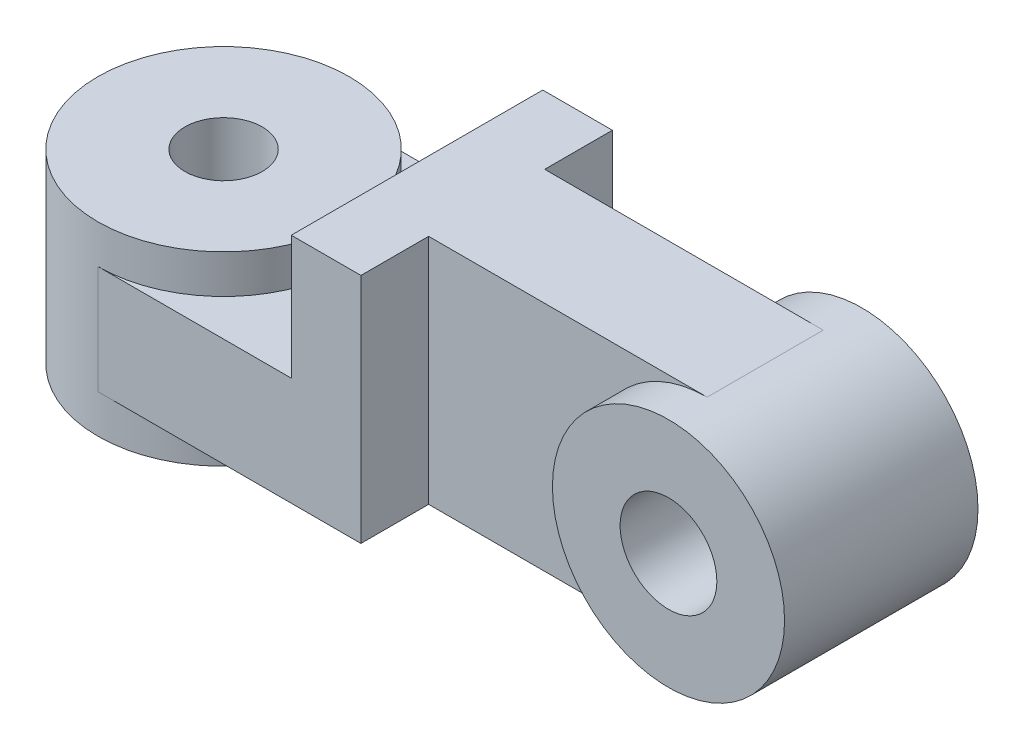
ISO-10303-21;
HEADER;
FILE_DESCRIPTION(('STEP AP214'),'2;1');
FILE_NAME('part.step','',(''),(''),'','','');
FILE_SCHEMA(('AUTOMOTIVE_DESIGN { 1 0 10303 214 1 1 1 1 }'));
ENDSEC;
DATA;
#1=APPLICATION_CONTEXT('core data for automotive mechanical design processes');
#2=APPLICATION_PROTOCOL_DEFINITION('international standard','automotive_design',2000,#1);
#3=PRODUCT_CONTEXT('',#1,'mechanical');
#4=PRODUCT('Part','Part','',(#3));
#5=PRODUCT_RELATED_PRODUCT_CATEGORY('part','',(#4));
#6=PRODUCT_DEFINITION_FORMATION('','',#4);
#7=PRODUCT_DEFINITION_CONTEXT('part definition',#1,'design');
#8=PRODUCT_DEFINITION('design','',#6,#7);
#9=PRODUCT_DEFINITION_SHAPE('','',#8);
#10=(LENGTH_UNIT() NAMED_UNIT(*) SI_UNIT(.MILLI.,.METRE.));
#11=(NAMED_UNIT(*) PLANE_ANGLE_UNIT() SI_UNIT($,.RADIAN.));
#12=(NAMED_UNIT(*) SI_UNIT($,.STERADIAN.) SOLID_ANGLE_UNIT());
#13=UNCERTAINTY_MEASURE_WITH_UNIT(LENGTH_MEASURE(1.E-05),#10,'distance_accuracy_value','');
#14=(GEOMETRIC_REPRESENTATION_CONTEXT(3) GLOBAL_UNCERTAINTY_ASSIGNED_CONTEXT((#13)) GLOBAL_UNIT_ASSIGNED_CONTEXT((#10,
#11,#12)) REPRESENTATION_CONTEXT('',''));
#15=CARTESIAN_POINT('',(0.,0.,0.));
#16=DIRECTION('',(0.,0.,1.));
#17=DIRECTION('',(1.,0.,0.));
#18=AXIS2_PLACEMENT_3D('',#15,#16,#17);
#19=CARTESIAN_POINT('',(68.,0.,0.));
#20=DIRECTION('',(-1.,0.,0.));
#21=DIRECTION('',(0.,0.,1.));
#22=AXIS2_PLACEMENT_3D('',#19,#20,#21);
#23=PLANE('',#22);
#24=DIRECTION('',(0.,-1.,0.));
#25=VECTOR('',#24,1.);
#26=CARTESIAN_POINT('',(68.,0.,15.));
#27=LINE('',#26,#25);
#28=CARTESIAN_POINT('',(68.,46.,15.));
#29=VERTEX_POINT('',#28);
#30=CARTESIAN_POINT('',(68.,-14.,15.));
#31=VERTEX_POINT('',#30);
#32=EDGE_CURVE('E56',#29,#31,#27,.T.);
#33=ORIENTED_EDGE('',*,*,#32,.F.);
#34=DIRECTION('',(0.,0.,1.));
#35=VECTOR('',#34,1.);
#36=CARTESIAN_POINT('',(68.,46.,32.5));
#37=LINE('',#36,#35);
#38=CARTESIAN_POINT('',(68.,46.,32.5));
#39=VERTEX_POINT('',#38);
#40=EDGE_CURVE('E160',#29,#39,#37,.T.);
#41=ORIENTED_EDGE('',*,*,#40,.T.);
#42=DIRECTION('',(0.,-1.,0.));
#43=VECTOR('',#42,1.);
#44=CARTESIAN_POINT('',(68.,-14.,32.5));
#45=LINE('',#44,#43);
#46=CARTESIAN_POINT('',(68.,-14.,32.5));
#47=VERTEX_POINT('',#46);
#48=EDGE_CURVE('E151',#39,#47,#45,.T.);
#49=ORIENTED_EDGE('',*,*,#48,.T.);
#50=DIRECTION('',(0.,0.,-1.));
#51=VECTOR('',#50,1.);
#52=CARTESIAN_POINT('',(68.,-14.,32.5));
#53=LINE('',#52,#51);
#54=EDGE_CURVE('E156',#47,#31,#53,.T.);
#55=ORIENTED_EDGE('',*,*,#54,.T.);
#56=EDGE_LOOP('',(#33,#41,#49,#55));
#57=FACE_BOUND('',#56,.T.);
#58=ADVANCED_FACE('F39',(#57),#23,.F.);
#59=CARTESIAN_POINT('',(0.,24.,0.));
#60=DIRECTION('',(0.,-1.,0.));
#61=DIRECTION('',(0.,0.,-1.));
#62=AXIS2_PLACEMENT_3D('',#59,#60,#61);
#63=CYLINDRICAL_SURFACE('',#62,10.);
#64=CARTESIAN_POINT('',(0.,24.,0.));
#65=DIRECTION('',(0.,1.,0.));
#66=DIRECTION('',(0.,0.,1.));
#67=AXIS2_PLACEMENT_3D('',#64,#65,#66);
#68=CIRCLE('',#67,10.);
#69=CARTESIAN_POINT('',(0.,24.,10.));
#70=VERTEX_POINT('',#69);
#71=EDGE_CURVE('E48',#70,#70,#68,.T.);
#72=ORIENTED_EDGE('',*,*,#71,.T.);
#73=EDGE_LOOP('',(#72));
#74=FACE_BOUND('',#73,.T.);
#75=CARTESIAN_POINT('',(0.,-24.,0.));
#76=DIRECTION('',(0.,1.,0.));
#77=DIRECTION('',(0.,0.,1.));
#78=AXIS2_PLACEMENT_3D('',#75,#76,#77);
#79=CIRCLE('',#78,10.);
#80=CARTESIAN_POINT('',(0.,-24.,10.));
#81=VERTEX_POINT('',#80);
#82=EDGE_CURVE('E196',#81,#81,#79,.T.);
#83=ORIENTED_EDGE('',*,*,#82,.F.);
#84=EDGE_LOOP('',(#83));
#85=FACE_BOUND('',#84,.T.);
#86=ADVANCED_FACE('F41',(#74,#85),#63,.F.);
#87=CARTESIAN_POINT('',(0.,24.,0.));
#88=DIRECTION('',(0.,-1.,0.));
#89=DIRECTION('',(0.,0.,-1.));
#90=AXIS2_PLACEMENT_3D('',#87,#88,#89);
#91=CYLINDRICAL_SURFACE('',#90,32.5);
#92=DIRECTION('',(0.,-1.,0.));
#93=VECTOR('',#92,1.);
#94=CARTESIAN_POINT('',(0.,14.,32.5));
#95=LINE('',#94,#93);
#96=CARTESIAN_POINT('',(0.,14.,32.5));
#97=VERTEX_POINT('',#96);
#98=CARTESIAN_POINT('',(0.,-14.,32.5));
#99=VERTEX_POINT('',#98);
#100=EDGE_CURVE('E193',#97,#99,#95,.T.);
#101=ORIENTED_EDGE('',*,*,#100,.F.);
#102=CARTESIAN_POINT('',(0.,14.,0.));
#103=DIRECTION('',(0.,1.,0.));
#104=DIRECTION('',(0.,0.,1.));
#105=AXIS2_PLACEMENT_3D('',#102,#103,#104);
#106=CIRCLE('',#105,32.5);
#107=CARTESIAN_POINT('',(0.,14.,-32.5));
#108=VERTEX_POINT('',#107);
#109=EDGE_CURVE('E174',#97,#108,#106,.T.);
#110=ORIENTED_EDGE('',*,*,#109,.T.);
#111=DIRECTION('',(0.,-1.,0.));
#112=VECTOR('',#111,1.);
#113=CARTESIAN_POINT('',(0.,14.,-32.5));
#114=LINE('',#113,#112);
#115=CARTESIAN_POINT('',(0.,-14.,-32.5));
#116=VERTEX_POINT('',#115);
#117=EDGE_CURVE('E185',#108,#116,#114,.T.);
#118=ORIENTED_EDGE('',*,*,#117,.T.);
#119=CARTESIAN_POINT('',(0.,-14.,0.));
#120=DIRECTION('',(0.,1.,0.));
#121=DIRECTION('',(0.,0.,1.));
#122=AXIS2_PLACEMENT_3D('',#119,#120,#121);
#123=CIRCLE('',#122,32.5);
#124=EDGE_CURVE('E173',#99,#116,#123,.T.);
#125=ORIENTED_EDGE('',*,*,#124,.F.);
#126=EDGE_LOOP('',(#101,#110,#118,#125));
#127=FACE_BOUND('',#126,.T.);
#128=CARTESIAN_POINT('',(0.,24.,0.));
#129=DIRECTION('',(0.,1.,0.));
#130=DIRECTION('',(0.,0.,1.));
#131=AXIS2_PLACEMENT_3D('',#128,#129,#130);
#132=CIRCLE('',#131,32.5);
#133=CARTESIAN_POINT('',(0.,24.,32.5));
#134=VERTEX_POINT('',#133);
#135=EDGE_CURVE('E11',#134,#134,#132,.T.);
#136=ORIENTED_EDGE('',*,*,#135,.F.);
#137=EDGE_LOOP('',(#136));
#138=FACE_BOUND('',#137,.T.);
#139=CARTESIAN_POINT('',(0.,-24.,0.));
#140=DIRECTION('',(0.,1.,0.));
#141=DIRECTION('',(0.,0.,1.));
#142=AXIS2_PLACEMENT_3D('',#139,#140,#141);
#143=CIRCLE('',#142,32.5);
#144=CARTESIAN_POINT('',(0.,-24.,32.5));
#145=VERTEX_POINT('',#144);
#146=EDGE_CURVE('E43',#145,#145,#143,.T.);
#147=ORIENTED_EDGE('',*,*,#146,.T.);
#148=EDGE_LOOP('',(#147));
#149=FACE_BOUND('',#148,.T.);
#150=ADVANCED_FACE('F204',(#127,#138,#149),#91,.T.);
#151=CARTESIAN_POINT('',(0.,24.,0.));
#152=DIRECTION('',(0.,1.,0.));
#153=DIRECTION('',(0.,0.,1.));
#154=AXIS2_PLACEMENT_3D('',#151,#152,#153);
#155=PLANE('',#154);
#156=ORIENTED_EDGE('',*,*,#71,.F.);
#157=EDGE_LOOP('',(#156));
#158=FACE_BOUND('',#157,.T.);
#159=ORIENTED_EDGE('',*,*,#135,.T.);
#160=EDGE_LOOP('',(#159));
#161=FACE_BOUND('',#160,.T.);
#162=ADVANCED_FACE('F209',(#158,#161),#155,.T.);
#163=CARTESIAN_POINT('',(0.,-24.,0.));
#164=DIRECTION('',(0.,1.,0.));
#165=DIRECTION('',(0.,0.,1.));
#166=AXIS2_PLACEMENT_3D('',#163,#164,#165);
#167=PLANE('',#166);
#168=ORIENTED_EDGE('',*,*,#82,.T.);
#169=EDGE_LOOP('',(#168));
#170=FACE_BOUND('',#169,.T.);
#171=ORIENTED_EDGE('',*,*,#146,.F.);
#172=EDGE_LOOP('',(#171));
#173=FACE_BOUND('',#172,.T.);
#174=ADVANCED_FACE('F206',(#170,#173),#167,.F.);
#175=CARTESIAN_POINT('',(0.,14.,32.5));
#176=DIRECTION('',(0.,0.,-1.));
#177=DIRECTION('',(-1.,0.,0.));
#178=AXIS2_PLACEMENT_3D('',#175,#176,#177);
#179=PLANE('',#178);
#180=DIRECTION('',(1.,0.,0.));
#181=VECTOR('',#180,1.);
#182=CARTESIAN_POINT('',(0.,-14.,32.5));
#183=LINE('',#182,#181);
#184=EDGE_CURVE('E188',#99,#47,#183,.T.);
#185=ORIENTED_EDGE('',*,*,#184,.T.);
#186=ORIENTED_EDGE('',*,*,#48,.F.);
#187=DIRECTION('',(-1.,0.,0.));
#188=VECTOR('',#187,1.);
#189=CARTESIAN_POINT('',(68.,46.,32.5));
#190=LINE('',#189,#188);
#191=CARTESIAN_POINT('',(50.,46.,32.5));
#192=VERTEX_POINT('',#191);
#193=EDGE_CURVE('E162',#39,#192,#190,.T.);
#194=ORIENTED_EDGE('',*,*,#193,.T.);
#195=DIRECTION('',(0.,-1.,0.));
#196=VECTOR('',#195,1.);
#197=CARTESIAN_POINT('',(50.,-14.,32.5));
#198=LINE('',#197,#196);
#199=CARTESIAN_POINT('',(50.,14.,32.5));
#200=VERTEX_POINT('',#199);
#201=EDGE_CURVE('E138',#192,#200,#198,.T.);
#202=ORIENTED_EDGE('',*,*,#201,.T.);
#203=DIRECTION('',(1.,0.,0.));
#204=VECTOR('',#203,1.);
#205=CARTESIAN_POINT('',(0.,14.,32.5));
#206=LINE('',#205,#204);
#207=EDGE_CURVE('E176',#97,#200,#206,.T.);
#208=ORIENTED_EDGE('',*,*,#207,.F.);
#209=ORIENTED_EDGE('',*,*,#100,.T.);
#210=EDGE_LOOP('',(#185,#186,#194,#202,#208,#209));
#211=FACE_BOUND('',#210,.T.);
#212=ADVANCED_FACE('F208',(#211),#179,.F.);
#213=CARTESIAN_POINT('',(0.,14.,-32.5));
#214=DIRECTION('',(0.,0.,1.));
#215=DIRECTION('',(1.,0.,0.));
#216=AXIS2_PLACEMENT_3D('',#213,#214,#215);
#217=PLANE('',#216);
#218=DIRECTION('',(-1.,0.,0.));
#219=VECTOR('',#218,1.);
#220=CARTESIAN_POINT('',(0.,-14.,-32.5));
#221=LINE('',#220,#219);
#222=CARTESIAN_POINT('',(68.,-14.,-32.5));
#223=VERTEX_POINT('',#222);
#224=EDGE_CURVE('E177',#223,#116,#221,.T.);
#225=ORIENTED_EDGE('',*,*,#224,.T.);
#226=ORIENTED_EDGE('',*,*,#117,.F.);
#227=DIRECTION('',(-1.,0.,0.));
#228=VECTOR('',#227,1.);
#229=CARTESIAN_POINT('',(0.,14.,-32.5));
#230=LINE('',#229,#228);
#231=CARTESIAN_POINT('',(50.,14.,-32.5));
#232=VERTEX_POINT('',#231);
#233=EDGE_CURVE('E182',#232,#108,#230,.T.);
#234=ORIENTED_EDGE('',*,*,#233,.F.);
#235=DIRECTION('',(0.,1.,0.));
#236=VECTOR('',#235,1.);
#237=CARTESIAN_POINT('',(50.,-14.,-32.5));
#238=LINE('',#237,#236);
#239=CARTESIAN_POINT('',(50.,46.,-32.5));
#240=VERTEX_POINT('',#239);
#241=EDGE_CURVE('E165',#232,#240,#238,.T.);
#242=ORIENTED_EDGE('',*,*,#241,.T.);
#243=DIRECTION('',(-1.,0.,0.));
#244=VECTOR('',#243,1.);
#245=CARTESIAN_POINT('',(68.,46.,-32.5));
#246=LINE('',#245,#244);
#247=CARTESIAN_POINT('',(68.,46.,-32.5));
#248=VERTEX_POINT('',#247);
#249=EDGE_CURVE('E170',#248,#240,#246,.T.);
#250=ORIENTED_EDGE('',*,*,#249,.F.);
#251=DIRECTION('',(0.,1.,0.));
#252=VECTOR('',#251,1.);
#253=CARTESIAN_POINT('',(68.,-14.,-32.5));
#254=LINE('',#253,#252);
#255=EDGE_CURVE('E158',#223,#248,#254,.T.);
#256=ORIENTED_EDGE('',*,*,#255,.F.);
#257=EDGE_LOOP('',(#225,#226,#234,#242,#250,#256));
#258=FACE_BOUND('',#257,.T.);
#259=ADVANCED_FACE('F215',(#258),#217,.F.);
#260=CARTESIAN_POINT('',(0.,14.,0.));
#261=DIRECTION('',(0.,1.,0.));
#262=DIRECTION('',(0.,0.,1.));
#263=AXIS2_PLACEMENT_3D('',#260,#261,#262);
#264=PLANE('',#263);
#265=ORIENTED_EDGE('',*,*,#109,.F.);
#266=ORIENTED_EDGE('',*,*,#207,.T.);
#267=DIRECTION('',(0.,0.,1.));
#268=VECTOR('',#267,1.);
#269=CARTESIAN_POINT('',(50.,14.,0.));
#270=LINE('',#269,#268);
#271=EDGE_CURVE('E179',#232,#200,#270,.T.);
#272=ORIENTED_EDGE('',*,*,#271,.F.);
#273=ORIENTED_EDGE('',*,*,#233,.T.);
#274=EDGE_LOOP('',(#265,#266,#272,#273));
#275=FACE_BOUND('',#274,.T.);
#276=ADVANCED_FACE('F242',(#275),#264,.T.);
#277=CARTESIAN_POINT('',(0.,-14.,0.));
#278=DIRECTION('',(0.,1.,0.));
#279=DIRECTION('',(0.,0.,1.));
#280=AXIS2_PLACEMENT_3D('',#277,#278,#279);
#281=PLANE('',#280);
#282=ORIENTED_EDGE('',*,*,#124,.T.);
#283=ORIENTED_EDGE('',*,*,#224,.F.);
#284=CARTESIAN_POINT('',(68.,-14.,-15.));
#285=VERTEX_POINT('',#284);
#286=EDGE_CURVE('E154',#285,#223,#53,.T.);
#287=ORIENTED_EDGE('',*,*,#286,.F.);
#288=DIRECTION('',(1.,0.,0.));
#289=VECTOR('',#288,1.);
#290=CARTESIAN_POINT('',(0.,-14.,-15.));
#291=LINE('',#290,#289);
#292=CARTESIAN_POINT('',(140.,-14.,-15.));
#293=VERTEX_POINT('',#292);
#294=EDGE_CURVE('E143',#285,#293,#291,.T.);
#295=ORIENTED_EDGE('',*,*,#294,.T.);
#296=DIRECTION('',(0.,0.,-1.));
#297=VECTOR('',#296,1.);
#298=CARTESIAN_POINT('',(140.,-14.,15.));
#299=LINE('',#298,#297);
#300=CARTESIAN_POINT('',(140.,-14.,15.));
#301=VERTEX_POINT('',#300);
#302=EDGE_CURVE('E124',#301,#293,#299,.T.);
#303=ORIENTED_EDGE('',*,*,#302,.F.);
#304=DIRECTION('',(1.,0.,0.));
#305=VECTOR('',#304,1.);
#306=CARTESIAN_POINT('',(0.,-14.,15.));
#307=LINE('',#306,#305);
#308=EDGE_CURVE('E149',#31,#301,#307,.T.);
#309=ORIENTED_EDGE('',*,*,#308,.F.);
#310=ORIENTED_EDGE('',*,*,#54,.F.);
#311=ORIENTED_EDGE('',*,*,#184,.F.);
#312=EDGE_LOOP('',(#282,#283,#287,#295,#303,#309,#310,#311));
#313=FACE_BOUND('',#312,.T.);
#314=ADVANCED_FACE('F237',(#313),#281,.F.);
#315=CARTESIAN_POINT('',(68.,46.,32.5));
#316=DIRECTION('',(0.,-1.,0.));
#317=DIRECTION('',(0.,0.,-1.));
#318=AXIS2_PLACEMENT_3D('',#315,#316,#317);
#319=PLANE('',#318);
#320=DIRECTION('',(0.,0.,1.));
#321=VECTOR('',#320,1.);
#322=CARTESIAN_POINT('',(50.,46.,32.5));
#323=LINE('',#322,#321);
#324=EDGE_CURVE('E155',#240,#192,#323,.T.);
#325=ORIENTED_EDGE('',*,*,#324,.T.);
#326=ORIENTED_EDGE('',*,*,#193,.F.);
#327=ORIENTED_EDGE('',*,*,#40,.F.);
#328=DIRECTION('',(1.,0.,0.));
#329=VECTOR('',#328,1.);
#330=CARTESIAN_POINT('',(0.,46.,15.));
#331=LINE('',#330,#329);
#332=CARTESIAN_POINT('',(140.,46.,15.));
#333=VERTEX_POINT('',#332);
#334=EDGE_CURVE('E137',#29,#333,#331,.T.);
#335=ORIENTED_EDGE('',*,*,#334,.T.);
#336=DIRECTION('',(0.,0.,-1.));
#337=VECTOR('',#336,1.);
#338=CARTESIAN_POINT('',(140.,46.,15.));
#339=LINE('',#338,#337);
#340=CARTESIAN_POINT('',(140.,46.,-15.));
#341=VERTEX_POINT('',#340);
#342=EDGE_CURVE('E121',#333,#341,#339,.T.);
#343=ORIENTED_EDGE('',*,*,#342,.T.);
#344=DIRECTION('',(1.,0.,0.));
#345=VECTOR('',#344,1.);
#346=CARTESIAN_POINT('',(0.,46.,-15.));
#347=LINE('',#346,#345);
#348=CARTESIAN_POINT('',(68.,46.,-15.));
#349=VERTEX_POINT('',#348);
#350=EDGE_CURVE('E129',#349,#341,#347,.T.);
#351=ORIENTED_EDGE('',*,*,#350,.F.);
#352=EDGE_CURVE('E64',#248,#349,#37,.T.);
#353=ORIENTED_EDGE('',*,*,#352,.F.);
#354=ORIENTED_EDGE('',*,*,#249,.T.);
#355=EDGE_LOOP('',(#325,#326,#327,#335,#343,#351,#353,#354));
#356=FACE_BOUND('',#355,.T.);
#357=ADVANCED_FACE('F135',(#356),#319,.F.);
#358=ORIENTED_EDGE('',*,*,#352,.T.);
#359=DIRECTION('',(0.,-1.,0.));
#360=VECTOR('',#359,1.);
#361=CARTESIAN_POINT('',(68.,0.,-15.));
#362=LINE('',#361,#360);
#363=EDGE_CURVE('E141',#349,#285,#362,.T.);
#364=ORIENTED_EDGE('',*,*,#363,.T.);
#365=ORIENTED_EDGE('',*,*,#286,.T.);
#366=ORIENTED_EDGE('',*,*,#255,.T.);
#367=EDGE_LOOP('',(#358,#364,#365,#366));
#368=FACE_BOUND('',#367,.T.);
#369=ADVANCED_FACE('F222',(#368),#23,.F.);
#370=CARTESIAN_POINT('',(50.,0.,0.));
#371=DIRECTION('',(-1.,0.,0.));
#372=DIRECTION('',(0.,0.,1.));
#373=AXIS2_PLACEMENT_3D('',#370,#371,#372);
#374=PLANE('',#373);
#375=ORIENTED_EDGE('',*,*,#241,.F.);
#376=ORIENTED_EDGE('',*,*,#271,.T.);
#377=ORIENTED_EDGE('',*,*,#201,.F.);
#378=ORIENTED_EDGE('',*,*,#324,.F.);
#379=EDGE_LOOP('',(#375,#376,#377,#378));
#380=FACE_BOUND('',#379,.T.);
#381=ADVANCED_FACE('F230',(#380),#374,.T.);
#382=CARTESIAN_POINT('',(0.,0.,15.));
#383=DIRECTION('',(0.,0.,1.));
#384=DIRECTION('',(1.,0.,0.));
#385=AXIS2_PLACEMENT_3D('',#382,#383,#384);
#386=PLANE('',#385);
#387=CARTESIAN_POINT('',(140.,16.,15.));
#388=DIRECTION('',(0.,0.,1.));
#389=DIRECTION('',(1.,0.,0.));
#390=AXIS2_PLACEMENT_3D('',#387,#388,#389);
#391=CIRCLE('',#390,30.);
#392=EDGE_CURVE('E148',#333,#301,#391,.T.);
#393=ORIENTED_EDGE('',*,*,#392,.F.);
#394=ORIENTED_EDGE('',*,*,#334,.F.);
#395=ORIENTED_EDGE('',*,*,#32,.T.);
#396=ORIENTED_EDGE('',*,*,#308,.T.);
#397=EDGE_LOOP('',(#393,#394,#395,#396));
#398=FACE_BOUND('',#397,.T.);
#399=ADVANCED_FACE('F235',(#398),#386,.T.);
#400=CARTESIAN_POINT('',(0.,0.,-15.));
#401=DIRECTION('',(0.,0.,1.));
#402=DIRECTION('',(1.,0.,0.));
#403=AXIS2_PLACEMENT_3D('',#400,#401,#402);
#404=PLANE('',#403);
#405=CARTESIAN_POINT('',(140.,16.,-15.));
#406=DIRECTION('',(0.,0.,1.));
#407=DIRECTION('',(1.,0.,0.));
#408=AXIS2_PLACEMENT_3D('',#405,#406,#407);
#409=CIRCLE('',#408,30.);
#410=EDGE_CURVE('E117',#341,#293,#409,.T.);
#411=ORIENTED_EDGE('',*,*,#410,.T.);
#412=ORIENTED_EDGE('',*,*,#294,.F.);
#413=ORIENTED_EDGE('',*,*,#363,.F.);
#414=ORIENTED_EDGE('',*,*,#350,.T.);
#415=EDGE_LOOP('',(#411,#412,#413,#414));
#416=FACE_BOUND('',#415,.T.);
#417=ADVANCED_FACE('F140',(#416),#404,.F.);
#418=CARTESIAN_POINT('',(140.,16.,25.));
#419=DIRECTION('',(0.,0.,-1.));
#420=DIRECTION('',(-1.,0.,0.));
#421=AXIS2_PLACEMENT_3D('',#418,#419,#420);
#422=CYLINDRICAL_SURFACE('',#421,12.5);
#423=CARTESIAN_POINT('',(140.,16.,25.));
#424=DIRECTION('',(0.,0.,1.));
#425=DIRECTION('',(1.,0.,0.));
#426=AXIS2_PLACEMENT_3D('',#423,#424,#425);
#427=CIRCLE('',#426,12.5);
#428=CARTESIAN_POINT('',(152.5,16.,25.));
#429=VERTEX_POINT('',#428);
#430=EDGE_CURVE('E280',#429,#429,#427,.T.);
#431=ORIENTED_EDGE('',*,*,#430,.T.);
#432=EDGE_LOOP('',(#431));
#433=FACE_BOUND('',#432,.T.);
#434=CARTESIAN_POINT('',(140.,16.,-25.));
#435=DIRECTION('',(0.,0.,1.));
#436=DIRECTION('',(1.,0.,0.));
#437=AXIS2_PLACEMENT_3D('',#434,#435,#436);
#438=CIRCLE('',#437,12.5);
#439=CARTESIAN_POINT('',(152.5,16.,-25.));
#440=VERTEX_POINT('',#439);
#441=EDGE_CURVE('E281',#440,#440,#438,.T.);
#442=ORIENTED_EDGE('',*,*,#441,.F.);
#443=EDGE_LOOP('',(#442));
#444=FACE_BOUND('',#443,.T.);
#445=ADVANCED_FACE('F289',(#433,#444),#422,.F.);
#446=CARTESIAN_POINT('',(140.,16.,25.));
#447=DIRECTION('',(0.,0.,-1.));
#448=DIRECTION('',(-1.,0.,0.));
#449=AXIS2_PLACEMENT_3D('',#446,#447,#448);
#450=CYLINDRICAL_SURFACE('',#449,30.);
#451=ORIENTED_EDGE('',*,*,#392,.T.);
#452=ORIENTED_EDGE('',*,*,#302,.T.);
#453=ORIENTED_EDGE('',*,*,#410,.F.);
#454=ORIENTED_EDGE('',*,*,#342,.F.);
#455=EDGE_LOOP('',(#451,#452,#453,#454));
#456=FACE_BOUND('',#455,.T.);
#457=CARTESIAN_POINT('',(140.,16.,25.));
#458=DIRECTION('',(0.,0.,1.));
#459=DIRECTION('',(1.,0.,0.));
#460=AXIS2_PLACEMENT_3D('',#457,#458,#459);
#461=CIRCLE('',#460,30.);
#462=CARTESIAN_POINT('',(170.,16.,25.));
#463=VERTEX_POINT('',#462);
#464=EDGE_CURVE('E130',#463,#463,#461,.T.);
#465=ORIENTED_EDGE('',*,*,#464,.F.);
#466=EDGE_LOOP('',(#465));
#467=FACE_BOUND('',#466,.T.);
#468=CARTESIAN_POINT('',(140.,16.,-25.));
#469=DIRECTION('',(0.,0.,1.));
#470=DIRECTION('',(1.,0.,0.));
#471=AXIS2_PLACEMENT_3D('',#468,#469,#470);
#472=CIRCLE('',#471,30.);
#473=CARTESIAN_POINT('',(170.,16.,-25.));
#474=VERTEX_POINT('',#473);
#475=EDGE_CURVE('E277',#474,#474,#472,.T.);
#476=ORIENTED_EDGE('',*,*,#475,.T.);
#477=EDGE_LOOP('',(#476));
#478=FACE_BOUND('',#477,.T.);
#479=ADVANCED_FACE('F119',(#456,#467,#478),#450,.T.);
#480=CARTESIAN_POINT('',(0.,0.,25.));
#481=DIRECTION('',(0.,0.,1.));
#482=DIRECTION('',(1.,0.,0.));
#483=AXIS2_PLACEMENT_3D('',#480,#481,#482);
#484=PLANE('',#483);
#485=ORIENTED_EDGE('',*,*,#430,.F.);
#486=EDGE_LOOP('',(#485));
#487=FACE_BOUND('',#486,.T.);
#488=ORIENTED_EDGE('',*,*,#464,.T.);
#489=EDGE_LOOP('',(#488));
#490=FACE_BOUND('',#489,.T.);
#491=ADVANCED_FACE('F292',(#487,#490),#484,.T.);
#492=CARTESIAN_POINT('',(0.,0.,-25.));
#493=DIRECTION('',(0.,0.,1.));
#494=DIRECTION('',(1.,0.,0.));
#495=AXIS2_PLACEMENT_3D('',#492,#493,#494);
#496=PLANE('',#495);
#497=ORIENTED_EDGE('',*,*,#441,.T.);
#498=EDGE_LOOP('',(#497));
#499=FACE_BOUND('',#498,.T.);
#500=ORIENTED_EDGE('',*,*,#475,.F.);
#501=EDGE_LOOP('',(#500));
#502=FACE_BOUND('',#501,.T.);
#503=ADVANCED_FACE('F295',(#499,#502),#496,.F.);
#504=CLOSED_SHELL('',(#58,#86,#150,#162,#174,#212,#259,#276,#314,#357,#369,#381,#399,#417,#445,
#479,#491,#503));
#505=MANIFOLD_SOLID_BREP('B2',#504);
#506=ADVANCED_BREP_SHAPE_REPRESENTATION('',(#18,#505),#14);
#507=SHAPE_DEFINITION_REPRESENTATION(#9,#506);
ENDSEC;
END-ISO-10303-21;
